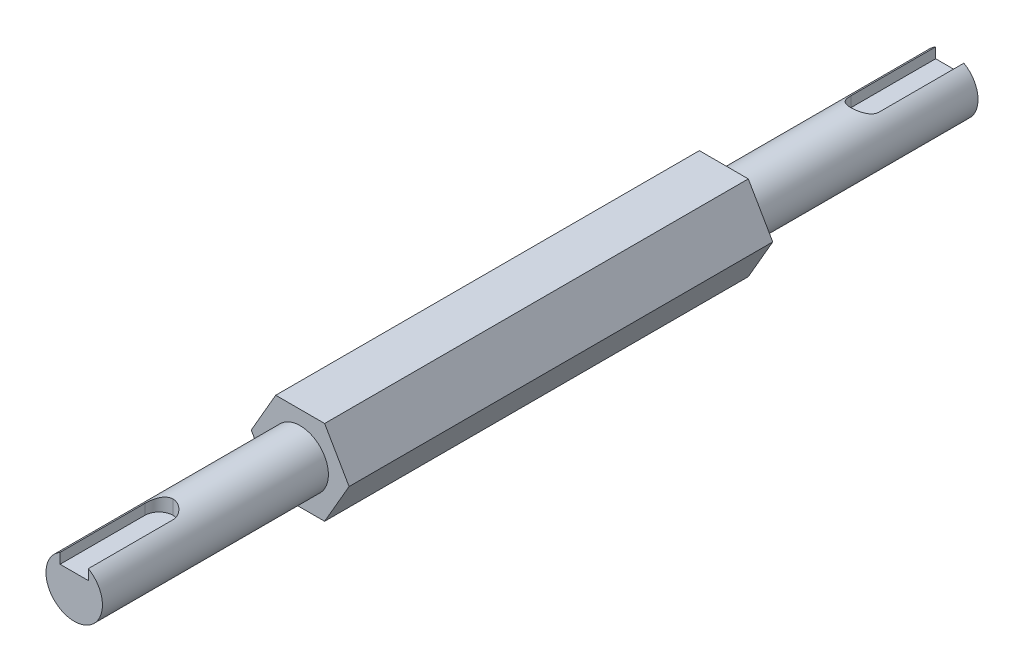
ISO-10303-21;
HEADER;
FILE_DESCRIPTION(('STEP AP214'),'2;1');
FILE_NAME('part.step','',(''),(''),'','','');
FILE_SCHEMA(('AUTOMOTIVE_DESIGN { 1 0 10303 214 1 1 1 1 }'));
ENDSEC;
DATA;
#1=APPLICATION_CONTEXT('core data for automotive mechanical design processes');
#2=APPLICATION_PROTOCOL_DEFINITION('international standard','automotive_design',2000,#1);
#3=PRODUCT_CONTEXT('',#1,'mechanical');
#4=PRODUCT('Part','Part','',(#3));
#5=PRODUCT_RELATED_PRODUCT_CATEGORY('part','',(#4));
#6=PRODUCT_DEFINITION_FORMATION('','',#4);
#7=PRODUCT_DEFINITION_CONTEXT('part definition',#1,'design');
#8=PRODUCT_DEFINITION('design','',#6,#7);
#9=PRODUCT_DEFINITION_SHAPE('','',#8);
#10=(LENGTH_UNIT() NAMED_UNIT(*) SI_UNIT(.MILLI.,.METRE.));
#11=(NAMED_UNIT(*) PLANE_ANGLE_UNIT() SI_UNIT($,.RADIAN.));
#12=(NAMED_UNIT(*) SI_UNIT($,.STERADIAN.) SOLID_ANGLE_UNIT());
#13=UNCERTAINTY_MEASURE_WITH_UNIT(LENGTH_MEASURE(1.E-05),#10,'distance_accuracy_value','');
#14=(GEOMETRIC_REPRESENTATION_CONTEXT(3) GLOBAL_UNCERTAINTY_ASSIGNED_CONTEXT((#13)) GLOBAL_UNIT_ASSIGNED_CONTEXT((#10,
#11,#12)) REPRESENTATION_CONTEXT('',''));
#15=CARTESIAN_POINT('',(0.,0.,0.));
#16=DIRECTION('',(0.,0.,1.));
#17=DIRECTION('',(1.,0.,0.));
#18=AXIS2_PLACEMENT_3D('',#15,#16,#17);
#19=CARTESIAN_POINT('',(0.,0.,-155.));
#20=DIRECTION('',(0.,0.,1.));
#21=DIRECTION('',(1.,0.,0.));
#22=AXIS2_PLACEMENT_3D('',#19,#20,#21);
#23=CYLINDRICAL_SURFACE('',#22,10.);
#24=CARTESIAN_POINT('',(0.,0.,-75.));
#25=DIRECTION('',(0.,0.,-1.));
#26=DIRECTION('',(-1.,0.,0.));
#27=AXIS2_PLACEMENT_3D('',#24,#25,#26);
#28=CIRCLE('',#27,10.);
#29=CARTESIAN_POINT('',(-10.,0.,-75.));
#30=VERTEX_POINT('',#29);
#31=EDGE_CURVE('E266',#30,#30,#28,.T.);
#32=ORIENTED_EDGE('',*,*,#31,.T.);
#33=EDGE_LOOP('',(#32));
#34=FACE_BOUND('',#33,.T.);
#35=CARTESIAN_POINT('',(5.,8.66025403784438,-125.));
#36=CARTESIAN_POINT('',(5.00002361888891,8.66021551330427,-124.869049639126));
#37=CARTESIAN_POINT('',(4.99485642352863,8.66322317171022,-124.738120661534));
#38=CARTESIAN_POINT('',(4.9743262011676,8.67504080296381,-124.477406344129));
#39=CARTESIAN_POINT('',(4.95896944028451,8.68384720982053,-124.347620351104));
#40=CARTESIAN_POINT('',(4.91836387161158,8.70690570763452,-124.090878105395));
#41=CARTESIAN_POINT('',(4.89317310468451,8.72112583452435,-123.96390978647));
#42=CARTESIAN_POINT('',(4.83323149405716,8.75448727669297,-123.712934259592));
#43=CARTESIAN_POINT('',(4.79847955294295,8.773629156865,-123.588927393325));
#44=CARTESIAN_POINT('',(4.68059587363615,8.83742329035318,-123.22307734072));
#45=CARTESIAN_POINT('',(4.58371167050504,8.88851945207841,-122.986633596926));
#46=CARTESIAN_POINT('',(4.35652740171114,9.00204021161088,-122.533173776049));
#47=CARTESIAN_POINT('',(4.22617416574287,9.0644827882417,-122.316189359844));
#48=CARTESIAN_POINT('',(3.92333046245637,9.19984701569684,-121.888468002505));
#49=CARTESIAN_POINT('',(3.74826652748174,9.27320802199905,-121.679691728181));
#50=CARTESIAN_POINT('',(3.3661902227377,9.41862187984104,-121.292897289751));
#51=CARTESIAN_POINT('',(3.15916803042063,9.49067432155078,-121.114888618014));
#52=CARTESIAN_POINT('',(2.82027569267716,9.59486177399818,-120.868732589407));
#53=CARTESIAN_POINT('',(2.69826543079268,9.6299691051782,-120.788009682604));
#54=CARTESIAN_POINT('',(2.44698124466883,9.69686293418397,-120.637234538355));
#55=CARTESIAN_POINT('',(2.31771046964858,9.72865085494352,-120.567177722721));
#56=CARTESIAN_POINT('',(2.05282662744898,9.78796784512354,-120.438468187722));
#57=CARTESIAN_POINT('',(1.91721936505834,9.81550071666006,-120.379805275111));
#58=CARTESIAN_POINT('',(1.64058795732737,9.86550553519196,-120.274500150322));
#59=CARTESIAN_POINT('',(1.49956734907817,9.88798072315259,-120.227850237429));
#60=CARTESIAN_POINT('',(1.24696348179509,9.92256495114501,-120.156652270877));
#61=CARTESIAN_POINT('',(1.13627328077336,9.93586871232813,-120.12948643006));
#62=CARTESIAN_POINT('',(0.912950872245471,9.95887130536837,-120.082731371089));
#63=CARTESIAN_POINT('',(0.800319100930296,9.96857093615972,-120.063140473744));
#64=CARTESIAN_POINT('',(0.573439771978736,9.98419294612303,-120.031669644401));
#65=CARTESIAN_POINT('',(0.459188926056762,9.99010599236984,-120.019808763575));
#66=CARTESIAN_POINT('',(0.229961151588944,9.99801728706722,-120.003965888074));
#67=CARTESIAN_POINT('',(0.114983943738853,10.0000139243983,-119.999987135915));
#68=CARTESIAN_POINT('',(0.,10.,-120.));
#69=B_SPLINE_CURVE_WITH_KNOTS('',3,(#35,#36,#37,#38,#39,#40,#41,#42,#43,#44,#45,#46,#47,#48,#49,
#50,#51,#52,#53,#54,#55,#56,#57,#58,#59,#60,#61,#62,#63,#64,#65,#66,#67,#68),.UNSPECIFIED.,.F.,
.F.,(4,2,2,2,2,2,2,2,2,2,2,2,2,2,2,2,4),(0.,0.392679602342989,0.785117948183225,
1.17527429103233,1.56547543400135,2.34355317866108,3.12287474188953,3.96590239319688,
4.80918967152436,5.26004529368137,5.7107068469499,6.16096335204243,6.6109305057813,
6.95487548064751,7.29874416704742,7.64345716907046,7.98831194828776),.UNSPECIFIED.);
#70=CARTESIAN_POINT('',(5.,8.66025403784438,-125.));
#71=VERTEX_POINT('',#70);
#72=CARTESIAN_POINT('',(0.,10.,-120.));
#73=VERTEX_POINT('',#72);
#74=EDGE_CURVE('E42',#71,#73,#69,.T.);
#75=ORIENTED_EDGE('',*,*,#74,.T.);
#76=CARTESIAN_POINT('',(0.,10.,-120.));
#77=CARTESIAN_POINT('',(-0.131991239469602,10.0000241782805,-119.999977601139));
#78=CARTESIAN_POINT('',(-0.263970628882904,9.99738765906262,-120.005225481239));
#79=CARTESIAN_POINT('',(-0.526850987566561,9.98697125681323,-120.026093501566));
#80=CARTESIAN_POINT('',(-0.657752368667024,9.97919343990117,-120.041709475205));
#81=CARTESIAN_POINT('',(-0.916935394044837,9.95871915073383,-120.08305084898));
#82=CARTESIAN_POINT('',(-1.0452262836237,9.94604534360643,-120.108729672694));
#83=CARTESIAN_POINT('',(-1.29890053779234,9.91610633855509,-120.169898539065));
#84=CARTESIAN_POINT('',(-1.42428372192544,9.8988408564894,-120.205389188901));
#85=CARTESIAN_POINT('',(-1.67114628273742,9.8601650174471,-120.285756351766));
#86=CARTESIAN_POINT('',(-1.79263094486756,9.83876057493977,-120.33061947903));
#87=CARTESIAN_POINT('',(-2.03118581554616,9.79229709918266,-120.429335856685));
#88=CARTESIAN_POINT('',(-2.14825433648659,9.76723668627511,-120.483192502085));
#89=CARTESIAN_POINT('',(-2.4919857638862,9.68737364782394,-120.6576535993));
#90=CARTESIAN_POINT('',(-2.71117534822375,9.62788908947369,-120.791149479643));
#91=CARTESIAN_POINT('',(-3.13757538731889,9.49780820199455,-121.097601637018));
#92=CARTESIAN_POINT('',(-3.34328207637021,9.42675973385601,-121.272442460829));
#93=CARTESIAN_POINT('',(-3.72387270816202,9.28300571887814,-121.652578854062));
#94=CARTESIAN_POINT('',(-3.89873165397419,9.21029888159085,-121.857898875953));
#95=CARTESIAN_POINT('',(-4.22640678760479,9.06488412578834,-122.312646249707));
#96=CARTESIAN_POINT('',(-4.37642491072512,8.99262189769115,-122.564268429368));
#97=CARTESIAN_POINT('',(-4.56745034472612,8.89626237102638,-122.96040971096));
#98=CARTESIAN_POINT('',(-4.62544363667002,8.8661569150135,-123.095522352474));
#99=CARTESIAN_POINT('',(-4.72955995362192,8.81105745348692,-123.371220243102));
#100=CARTESIAN_POINT('',(-4.7756910296989,8.786059983483,-123.511801705439));
#101=CARTESIAN_POINT('',(-4.84586480669606,8.74750169059237,-123.762958804369));
#102=CARTESIAN_POINT('',(-4.87255148593207,8.73263643182637,-123.872605814687));
#103=CARTESIAN_POINT('',(-4.9185074627793,8.70683502441639,-124.093883756156));
#104=CARTESIAN_POINT('',(-4.93777858999978,8.69589790664246,-124.205514190825));
#105=CARTESIAN_POINT('',(-4.96877057631204,8.67822894216377,-124.430563629019));
#106=CARTESIAN_POINT('',(-4.98046391773374,8.67151242462562,-124.543987635783));
#107=CARTESIAN_POINT('',(-4.99608785784789,8.66251234350782,-124.771604069188));
#108=CARTESIAN_POINT('',(-5.0000142599403,8.66023117642948,-124.885796877808));
#109=CARTESIAN_POINT('',(-5.,8.66025403784439,-125.));
#110=B_SPLINE_CURVE_WITH_KNOTS('',3,(#76,#77,#78,#79,#80,#81,#82,#83,#84,#85,#86,#87,#88,#89,
#90,#91,#92,#93,#94,#95,#96,#97,#98,#99,#100,#101,#102,#103,#104,#105,#106,#107,#108,#109),
.UNSPECIFIED.,.F.,.F.,(4,2,2,2,2,2,2,2,2,2,2,2,2,2,2,2,4),(0.,0.395824516939796,
0.791490061573844,1.1853454771675,1.57922527097024,1.97254632528296,2.36601619341385,
3.15295336018615,3.98702315318757,4.82176574617551,5.72186996410697,6.17159557922642,
6.62101514813637,6.96218512181261,7.30327086594243,7.64558837579788,7.98809079474593),.UNSPECIFIED.);
#111=CARTESIAN_POINT('',(-5.,8.66025403784439,-125.));
#112=VERTEX_POINT('',#111);
#113=EDGE_CURVE('E11',#73,#112,#110,.T.);
#114=ORIENTED_EDGE('',*,*,#113,.T.);
#115=DIRECTION('',(0.,0.,1.));
#116=VECTOR('',#115,1.);
#117=CARTESIAN_POINT('',(-5.,8.66025403784439,-155.));
#118=LINE('',#117,#116);
#119=CARTESIAN_POINT('',(-5.,8.66025403784439,-155.));
#120=VERTEX_POINT('',#119);
#121=EDGE_CURVE('E151',#120,#112,#118,.T.);
#122=ORIENTED_EDGE('',*,*,#121,.F.);
#123=CARTESIAN_POINT('',(0.,0.,-155.));
#124=DIRECTION('',(0.,0.,-1.));
#125=DIRECTION('',(-1.,0.,0.));
#126=AXIS2_PLACEMENT_3D('',#123,#124,#125);
#127=CIRCLE('',#126,10.);
#128=CARTESIAN_POINT('',(5.,8.66025403784438,-155.));
#129=VERTEX_POINT('',#128);
#130=EDGE_CURVE('E166',#129,#120,#127,.T.);
#131=ORIENTED_EDGE('',*,*,#130,.F.);
#132=DIRECTION('',(0.,0.,1.));
#133=VECTOR('',#132,1.);
#134=CARTESIAN_POINT('',(5.,8.66025403784438,-155.));
#135=LINE('',#134,#133);
#136=EDGE_CURVE('E355',#71,#129,#135,.F.);
#137=ORIENTED_EDGE('',*,*,#136,.F.);
#138=EDGE_LOOP('',(#75,#114,#122,#131,#137));
#139=FACE_BOUND('',#138,.T.);
#140=ADVANCED_FACE('F32',(#34,#139),#23,.T.);
#141=CARTESIAN_POINT('',(0.,0.,-155.));
#142=DIRECTION('',(0.,0.,-1.));
#143=DIRECTION('',(-1.,0.,0.));
#144=AXIS2_PLACEMENT_3D('',#141,#142,#143);
#145=PLANE('',#144);
#146=DIRECTION('',(1.,0.,0.));
#147=VECTOR('',#146,1.);
#148=CARTESIAN_POINT('',(-5.,5.,-155.));
#149=LINE('',#148,#147);
#150=CARTESIAN_POINT('',(-5.,5.,-155.));
#151=VERTEX_POINT('',#150);
#152=CARTESIAN_POINT('',(5.,5.,-155.));
#153=VERTEX_POINT('',#152);
#154=EDGE_CURVE('E155',#151,#153,#149,.T.);
#155=ORIENTED_EDGE('',*,*,#154,.T.);
#156=DIRECTION('',(0.,1.,0.));
#157=VECTOR('',#156,1.);
#158=CARTESIAN_POINT('',(5.,23.6468090190601,-155.));
#159=LINE('',#158,#157);
#160=EDGE_CURVE('E161',#153,#129,#159,.T.);
#161=ORIENTED_EDGE('',*,*,#160,.T.);
#162=ORIENTED_EDGE('',*,*,#130,.T.);
#163=DIRECTION('',(0.,-1.,0.));
#164=VECTOR('',#163,1.);
#165=CARTESIAN_POINT('',(-5.,0.,-155.));
#166=LINE('',#165,#164);
#167=EDGE_CURVE('E146',#120,#151,#166,.T.);
#168=ORIENTED_EDGE('',*,*,#167,.T.);
#169=EDGE_LOOP('',(#155,#161,#162,#168));
#170=FACE_BOUND('',#169,.T.);
#171=ADVANCED_FACE('F164',(#170),#145,.T.);
#172=CARTESIAN_POINT('',(17.3205080756888,0.,75.));
#173=DIRECTION('',(-0.866025403784438,-0.5,0.));
#174=DIRECTION('',(0.5,-0.866025403784439,0.));
#175=AXIS2_PLACEMENT_3D('',#172,#173,#174);
#176=PLANE('',#175);
#177=DIRECTION('',(-0.5,0.866025403784438,0.));
#178=VECTOR('',#177,1.);
#179=CARTESIAN_POINT('',(17.3205080756888,0.,-75.));
#180=LINE('',#179,#178);
#181=CARTESIAN_POINT('',(17.3205080756888,0.,-75.));
#182=VERTEX_POINT('',#181);
#183=CARTESIAN_POINT('',(8.66025403784438,15.,-75.));
#184=VERTEX_POINT('',#183);
#185=EDGE_CURVE('E281',#182,#184,#180,.T.);
#186=ORIENTED_EDGE('',*,*,#185,.T.);
#187=DIRECTION('',(0.,0.,-1.));
#188=VECTOR('',#187,1.);
#189=CARTESIAN_POINT('',(8.66025403784438,15.,75.));
#190=LINE('',#189,#188);
#191=CARTESIAN_POINT('',(8.66025403784438,15.,75.));
#192=VERTEX_POINT('',#191);
#193=EDGE_CURVE('E274',#192,#184,#190,.T.);
#194=ORIENTED_EDGE('',*,*,#193,.F.);
#195=DIRECTION('',(-0.5,0.866025403784438,0.));
#196=VECTOR('',#195,1.);
#197=CARTESIAN_POINT('',(17.3205080756888,0.,75.));
#198=LINE('',#197,#196);
#199=CARTESIAN_POINT('',(17.3205080756888,0.,75.));
#200=VERTEX_POINT('',#199);
#201=EDGE_CURVE('E283',#200,#192,#198,.T.);
#202=ORIENTED_EDGE('',*,*,#201,.F.);
#203=DIRECTION('',(0.,0.,-1.));
#204=VECTOR('',#203,1.);
#205=CARTESIAN_POINT('',(17.3205080756888,0.,75.));
#206=LINE('',#205,#204);
#207=EDGE_CURVE('E297',#200,#182,#206,.T.);
#208=ORIENTED_EDGE('',*,*,#207,.T.);
#209=EDGE_LOOP('',(#186,#194,#202,#208));
#210=FACE_BOUND('',#209,.T.);
#211=ADVANCED_FACE('F252',(#210),#176,.F.);
#212=CARTESIAN_POINT('',(8.66025403784438,15.,75.));
#213=DIRECTION('',(0.,-1.,0.));
#214=DIRECTION('',(1.,0.,0.));
#215=AXIS2_PLACEMENT_3D('',#212,#213,#214);
#216=PLANE('',#215);
#217=DIRECTION('',(-1.,0.,0.));
#218=VECTOR('',#217,1.);
#219=CARTESIAN_POINT('',(8.66025403784438,15.,-75.));
#220=LINE('',#219,#218);
#221=CARTESIAN_POINT('',(-8.66025403784438,15.,-75.));
#222=VERTEX_POINT('',#221);
#223=EDGE_CURVE('E299',#184,#222,#220,.T.);
#224=ORIENTED_EDGE('',*,*,#223,.T.);
#225=DIRECTION('',(0.,0.,-1.));
#226=VECTOR('',#225,1.);
#227=CARTESIAN_POINT('',(-8.66025403784438,15.,75.));
#228=LINE('',#227,#226);
#229=CARTESIAN_POINT('',(-8.66025403784438,15.,75.));
#230=VERTEX_POINT('',#229);
#231=EDGE_CURVE('E319',#230,#222,#228,.T.);
#232=ORIENTED_EDGE('',*,*,#231,.F.);
#233=DIRECTION('',(-1.,0.,0.));
#234=VECTOR('',#233,1.);
#235=CARTESIAN_POINT('',(8.66025403784438,15.,75.));
#236=LINE('',#235,#234);
#237=EDGE_CURVE('E286',#192,#230,#236,.T.);
#238=ORIENTED_EDGE('',*,*,#237,.F.);
#239=ORIENTED_EDGE('',*,*,#193,.T.);
#240=EDGE_LOOP('',(#224,#232,#238,#239));
#241=FACE_BOUND('',#240,.T.);
#242=ADVANCED_FACE('F249',(#241),#216,.F.);
#243=CARTESIAN_POINT('',(-8.66025403784438,15.,75.));
#244=DIRECTION('',(0.866025403784438,-0.5,0.));
#245=DIRECTION('',(0.5,0.866025403784439,0.));
#246=AXIS2_PLACEMENT_3D('',#243,#244,#245);
#247=PLANE('',#246);
#248=DIRECTION('',(-0.5,-0.866025403784438,0.));
#249=VECTOR('',#248,1.);
#250=CARTESIAN_POINT('',(-8.66025403784438,15.,-75.));
#251=LINE('',#250,#249);
#252=CARTESIAN_POINT('',(-17.3205080756888,0.,-75.));
#253=VERTEX_POINT('',#252);
#254=EDGE_CURVE('E301',#222,#253,#251,.T.);
#255=ORIENTED_EDGE('',*,*,#254,.T.);
#256=DIRECTION('',(0.,0.,-1.));
#257=VECTOR('',#256,1.);
#258=CARTESIAN_POINT('',(-17.3205080756888,0.,75.));
#259=LINE('',#258,#257);
#260=CARTESIAN_POINT('',(-17.3205080756888,0.,75.));
#261=VERTEX_POINT('',#260);
#262=EDGE_CURVE('E316',#261,#253,#259,.T.);
#263=ORIENTED_EDGE('',*,*,#262,.F.);
#264=DIRECTION('',(-0.5,-0.866025403784438,0.));
#265=VECTOR('',#264,1.);
#266=CARTESIAN_POINT('',(-8.66025403784438,15.,75.));
#267=LINE('',#266,#265);
#268=EDGE_CURVE('E289',#230,#261,#267,.T.);
#269=ORIENTED_EDGE('',*,*,#268,.F.);
#270=ORIENTED_EDGE('',*,*,#231,.T.);
#271=EDGE_LOOP('',(#255,#263,#269,#270));
#272=FACE_BOUND('',#271,.T.);
#273=ADVANCED_FACE('F245',(#272),#247,.F.);
#274=CARTESIAN_POINT('',(-17.3205080756888,0.,75.));
#275=DIRECTION('',(0.866025403784438,0.5,0.));
#276=DIRECTION('',(-0.5,0.866025403784439,0.));
#277=AXIS2_PLACEMENT_3D('',#274,#275,#276);
#278=PLANE('',#277);
#279=DIRECTION('',(0.5,-0.866025403784438,0.));
#280=VECTOR('',#279,1.);
#281=CARTESIAN_POINT('',(-17.3205080756888,0.,-75.));
#282=LINE('',#281,#280);
#283=CARTESIAN_POINT('',(-8.66025403784438,-15.,-75.));
#284=VERTEX_POINT('',#283);
#285=EDGE_CURVE('E303',#253,#284,#282,.T.);
#286=ORIENTED_EDGE('',*,*,#285,.T.);
#287=DIRECTION('',(0.,0.,-1.));
#288=VECTOR('',#287,1.);
#289=CARTESIAN_POINT('',(-8.66025403784438,-15.,75.));
#290=LINE('',#289,#288);
#291=CARTESIAN_POINT('',(-8.66025403784438,-15.,75.));
#292=VERTEX_POINT('',#291);
#293=EDGE_CURVE('E313',#292,#284,#290,.T.);
#294=ORIENTED_EDGE('',*,*,#293,.F.);
#295=DIRECTION('',(0.5,-0.866025403784438,0.));
#296=VECTOR('',#295,1.);
#297=CARTESIAN_POINT('',(-17.3205080756888,0.,75.));
#298=LINE('',#297,#296);
#299=EDGE_CURVE('E291',#261,#292,#298,.T.);
#300=ORIENTED_EDGE('',*,*,#299,.F.);
#301=ORIENTED_EDGE('',*,*,#262,.T.);
#302=EDGE_LOOP('',(#286,#294,#300,#301));
#303=FACE_BOUND('',#302,.T.);
#304=ADVANCED_FACE('F241',(#303),#278,.F.);
#305=CARTESIAN_POINT('',(-8.66025403784438,-15.,75.));
#306=DIRECTION('',(0.,1.,0.));
#307=DIRECTION('',(-1.,0.,0.));
#308=AXIS2_PLACEMENT_3D('',#305,#306,#307);
#309=PLANE('',#308);
#310=DIRECTION('',(1.,0.,0.));
#311=VECTOR('',#310,1.);
#312=CARTESIAN_POINT('',(-8.66025403784438,-15.,-75.));
#313=LINE('',#312,#311);
#314=CARTESIAN_POINT('',(8.66025403784439,-15.,-75.));
#315=VERTEX_POINT('',#314);
#316=EDGE_CURVE('E305',#284,#315,#313,.T.);
#317=ORIENTED_EDGE('',*,*,#316,.T.);
#318=DIRECTION('',(0.,0.,-1.));
#319=VECTOR('',#318,1.);
#320=CARTESIAN_POINT('',(8.66025403784439,-15.,75.));
#321=LINE('',#320,#319);
#322=CARTESIAN_POINT('',(8.66025403784439,-15.,75.));
#323=VERTEX_POINT('',#322);
#324=EDGE_CURVE('E310',#323,#315,#321,.T.);
#325=ORIENTED_EDGE('',*,*,#324,.F.);
#326=DIRECTION('',(1.,0.,0.));
#327=VECTOR('',#326,1.);
#328=CARTESIAN_POINT('',(-8.66025403784438,-15.,75.));
#329=LINE('',#328,#327);
#330=EDGE_CURVE('E293',#292,#323,#329,.T.);
#331=ORIENTED_EDGE('',*,*,#330,.F.);
#332=ORIENTED_EDGE('',*,*,#293,.T.);
#333=EDGE_LOOP('',(#317,#325,#331,#332));
#334=FACE_BOUND('',#333,.T.);
#335=ADVANCED_FACE('F237',(#334),#309,.F.);
#336=CARTESIAN_POINT('',(8.66025403784439,-15.,75.));
#337=DIRECTION('',(-0.866025403784438,0.5,0.));
#338=DIRECTION('',(-0.5,-0.866025403784439,0.));
#339=AXIS2_PLACEMENT_3D('',#336,#337,#338);
#340=PLANE('',#339);
#341=DIRECTION('',(0.5,0.866025403784438,0.));
#342=VECTOR('',#341,1.);
#343=CARTESIAN_POINT('',(8.66025403784439,-15.,-75.));
#344=LINE('',#343,#342);
#345=EDGE_CURVE('E287',#315,#182,#344,.T.);
#346=ORIENTED_EDGE('',*,*,#345,.T.);
#347=ORIENTED_EDGE('',*,*,#207,.F.);
#348=DIRECTION('',(0.5,0.866025403784438,0.));
#349=VECTOR('',#348,1.);
#350=CARTESIAN_POINT('',(8.66025403784439,-15.,75.));
#351=LINE('',#350,#349);
#352=EDGE_CURVE('E295',#323,#200,#351,.T.);
#353=ORIENTED_EDGE('',*,*,#352,.F.);
#354=ORIENTED_EDGE('',*,*,#324,.T.);
#355=EDGE_LOOP('',(#346,#347,#353,#354));
#356=FACE_BOUND('',#355,.T.);
#357=ADVANCED_FACE('F230',(#356),#340,.F.);
#358=CARTESIAN_POINT('',(0.,0.,75.));
#359=DIRECTION('',(0.,0.,1.));
#360=DIRECTION('',(1.,0.,0.));
#361=AXIS2_PLACEMENT_3D('',#358,#359,#360);
#362=PLANE('',#361);
#363=CARTESIAN_POINT('',(0.,0.,75.));
#364=DIRECTION('',(0.,0.,1.));
#365=DIRECTION('',(1.,0.,0.));
#366=AXIS2_PLACEMENT_3D('',#363,#364,#365);
#367=CIRCLE('',#366,10.);
#368=CARTESIAN_POINT('',(10.,0.,75.));
#369=VERTEX_POINT('',#368);
#370=EDGE_CURVE('E268',#369,#369,#367,.T.);
#371=ORIENTED_EDGE('',*,*,#370,.F.);
#372=EDGE_LOOP('',(#371));
#373=FACE_BOUND('',#372,.T.);
#374=ORIENTED_EDGE('',*,*,#201,.T.);
#375=ORIENTED_EDGE('',*,*,#237,.T.);
#376=ORIENTED_EDGE('',*,*,#268,.T.);
#377=ORIENTED_EDGE('',*,*,#299,.T.);
#378=ORIENTED_EDGE('',*,*,#330,.T.);
#379=ORIENTED_EDGE('',*,*,#352,.T.);
#380=EDGE_LOOP('',(#374,#375,#376,#377,#378,#379));
#381=FACE_BOUND('',#380,.T.);
#382=ADVANCED_FACE('F226',(#373,#381),#362,.T.);
#383=CARTESIAN_POINT('',(0.,0.,-75.));
#384=DIRECTION('',(0.,0.,1.));
#385=DIRECTION('',(1.,0.,0.));
#386=AXIS2_PLACEMENT_3D('',#383,#384,#385);
#387=PLANE('',#386);
#388=ORIENTED_EDGE('',*,*,#31,.F.);
#389=EDGE_LOOP('',(#388));
#390=FACE_BOUND('',#389,.T.);
#391=ORIENTED_EDGE('',*,*,#185,.F.);
#392=ORIENTED_EDGE('',*,*,#345,.F.);
#393=ORIENTED_EDGE('',*,*,#316,.F.);
#394=ORIENTED_EDGE('',*,*,#285,.F.);
#395=ORIENTED_EDGE('',*,*,#254,.F.);
#396=ORIENTED_EDGE('',*,*,#223,.F.);
#397=EDGE_LOOP('',(#391,#392,#393,#394,#395,#396));
#398=FACE_BOUND('',#397,.T.);
#399=ADVANCED_FACE('F224',(#390,#398),#387,.F.);
#400=CARTESIAN_POINT('',(0.,0.,155.));
#401=DIRECTION('',(0.,0.,-1.));
#402=DIRECTION('',(-1.,0.,0.));
#403=AXIS2_PLACEMENT_3D('',#400,#401,#402);
#404=CYLINDRICAL_SURFACE('',#403,10.);
#405=DIRECTION('',(0.,0.,-1.));
#406=VECTOR('',#405,1.);
#407=CARTESIAN_POINT('',(-5.,8.66025403784439,155.));
#408=LINE('',#407,#406);
#409=CARTESIAN_POINT('',(-5.,8.66025403784439,155.));
#410=VERTEX_POINT('',#409);
#411=CARTESIAN_POINT('',(-5.,8.66025403784439,125.));
#412=VERTEX_POINT('',#411);
#413=EDGE_CURVE('E350',#410,#412,#408,.T.);
#414=ORIENTED_EDGE('',*,*,#413,.T.);
#415=CARTESIAN_POINT('',(-5.,8.66025403784439,125.));
#416=CARTESIAN_POINT('',(-5.0000236188889,8.66021551330428,124.869049639126));
#417=CARTESIAN_POINT('',(-4.99485642352862,8.66322317171022,124.738120661534));
#418=CARTESIAN_POINT('',(-4.9743262011676,8.67504080296381,124.477406344129));
#419=CARTESIAN_POINT('',(-4.95896944028451,8.68384720982053,124.347620351104));
#420=CARTESIAN_POINT('',(-4.91836387161157,8.70690570763452,124.090878105395));
#421=CARTESIAN_POINT('',(-4.89317310468451,8.72112583452435,123.96390978647));
#422=CARTESIAN_POINT('',(-4.83323149405715,8.75448727669297,123.712934259592));
#423=CARTESIAN_POINT('',(-4.79847955294295,8.773629156865,123.588927393325));
#424=CARTESIAN_POINT('',(-4.68059587363615,8.83742329035318,123.22307734072));
#425=CARTESIAN_POINT('',(-4.58371167050503,8.88851945207841,122.986633596926));
#426=CARTESIAN_POINT('',(-4.35652740171114,9.00204021161088,122.533173776049));
#427=CARTESIAN_POINT('',(-4.22617416574286,9.06448278824171,122.316189359844));
#428=CARTESIAN_POINT('',(-3.92333046245637,9.19984701569684,121.888468002505));
#429=CARTESIAN_POINT('',(-3.74826652748173,9.27320802199905,121.679691728181));
#430=CARTESIAN_POINT('',(-3.3661902227377,9.41862187984105,121.292897289751));
#431=CARTESIAN_POINT('',(-3.15916803042063,9.49067432155078,121.114888618014));
#432=CARTESIAN_POINT('',(-2.82027569267716,9.59486177399818,120.868732589407));
#433=CARTESIAN_POINT('',(-2.69826543079268,9.6299691051782,120.788009682604));
#434=CARTESIAN_POINT('',(-2.44698124466883,9.69686293418397,120.637234538355));
#435=CARTESIAN_POINT('',(-2.31771046964858,9.72865085494352,120.567177722721));
#436=CARTESIAN_POINT('',(-2.05282662744898,9.78796784512354,120.438468187722));
#437=CARTESIAN_POINT('',(-1.91721936505834,9.81550071666006,120.379805275111));
#438=CARTESIAN_POINT('',(-1.64058795732737,9.86550553519196,120.274500150322));
#439=CARTESIAN_POINT('',(-1.49956734907817,9.88798072315259,120.227850237429));
#440=CARTESIAN_POINT('',(-1.24696348179509,9.92256495114501,120.156652270877));
#441=CARTESIAN_POINT('',(-1.13627328077336,9.93586871232813,120.12948643006));
#442=CARTESIAN_POINT('',(-0.912950872245469,9.95887130536837,120.082731371089));
#443=CARTESIAN_POINT('',(-0.800319100930295,9.96857093615972,120.063140473744));
#444=CARTESIAN_POINT('',(-0.573439771978735,9.98419294612303,120.031669644401));
#445=CARTESIAN_POINT('',(-0.45918892605676,9.99010599236984,120.019808763575));
#446=CARTESIAN_POINT('',(-0.229961151588942,9.99801728706722,120.003965888074));
#447=CARTESIAN_POINT('',(-0.114983943738852,10.0000139243983,119.999987135915));
#448=CARTESIAN_POINT('',(0.,10.,120.));
#449=B_SPLINE_CURVE_WITH_KNOTS('',3,(#415,#416,#417,#418,#419,#420,#421,#422,#423,#424,#425,
#426,#427,#428,#429,#430,#431,#432,#433,#434,#435,#436,#437,#438,#439,#440,#441,#442,#443,#444,
#445,#446,#447,#448),.UNSPECIFIED.,.F.,.F.,(4,2,2,2,2,2,2,2,2,2,2,2,2,2,2,2,4),(0.,
0.392679602342989,0.785117948183225,1.17527429103233,1.56547543400135,2.3435531786611,
3.12287474188953,3.96590239319688,4.80918967152436,5.26004529368137,5.7107068469499,
6.16096335204242,6.6109305057813,6.95487548064751,7.29874416704742,7.64345716907046,
7.98831194828776),.UNSPECIFIED.);
#450=CARTESIAN_POINT('',(0.,10.,120.));
#451=VERTEX_POINT('',#450);
#452=EDGE_CURVE('E168',#412,#451,#449,.T.);
#453=ORIENTED_EDGE('',*,*,#452,.T.);
#454=CARTESIAN_POINT('',(0.,10.,120.));
#455=CARTESIAN_POINT('',(0.131991239469603,10.0000241782805,119.999977601139));
#456=CARTESIAN_POINT('',(0.263970628882905,9.99738765906262,120.005225481239));
#457=CARTESIAN_POINT('',(0.526850987566562,9.98697125681323,120.026093501566));
#458=CARTESIAN_POINT('',(0.657752368667025,9.97919343990117,120.041709475205));
#459=CARTESIAN_POINT('',(0.916935394044838,9.95871915073382,120.08305084898));
#460=CARTESIAN_POINT('',(1.04522628362371,9.94604534360643,120.108729672694));
#461=CARTESIAN_POINT('',(1.29890053779234,9.91610633855509,120.169898539065));
#462=CARTESIAN_POINT('',(1.42428372192544,9.8988408564894,120.205389188901));
#463=CARTESIAN_POINT('',(1.67114628273742,9.8601650174471,120.285756351766));
#464=CARTESIAN_POINT('',(1.79263094486756,9.83876057493976,120.33061947903));
#465=CARTESIAN_POINT('',(2.03118581554616,9.79229709918265,120.429335856685));
#466=CARTESIAN_POINT('',(2.14825433648659,9.76723668627511,120.483192502085));
#467=CARTESIAN_POINT('',(2.4919857638862,9.68737364782394,120.6576535993));
#468=CARTESIAN_POINT('',(2.71117534822376,9.62788908947369,120.791149479643));
#469=CARTESIAN_POINT('',(3.13757538731889,9.49780820199455,121.097601637018));
#470=CARTESIAN_POINT('',(3.34328207637021,9.42675973385601,121.272442460829));
#471=CARTESIAN_POINT('',(3.72387270816202,9.28300571887814,121.652578854062));
#472=CARTESIAN_POINT('',(3.89873165397419,9.21029888159085,121.857898875953));
#473=CARTESIAN_POINT('',(4.22640678760479,9.06488412578834,122.312646249707));
#474=CARTESIAN_POINT('',(4.37642491072513,8.99262189769115,122.564268429368));
#475=CARTESIAN_POINT('',(4.56745034472612,8.89626237102638,122.96040971096));
#476=CARTESIAN_POINT('',(4.62544363667002,8.86615691501351,123.095522352474));
#477=CARTESIAN_POINT('',(4.72955995362192,8.81105745348692,123.371220243102));
#478=CARTESIAN_POINT('',(4.7756910296989,8.78605998348299,123.511801705439));
#479=CARTESIAN_POINT('',(4.84586480669607,8.74750169059237,123.762958804369));
#480=CARTESIAN_POINT('',(4.87255148593207,8.73263643182637,123.872605814687));
#481=CARTESIAN_POINT('',(4.9185074627793,8.70683502441639,124.093883756156));
#482=CARTESIAN_POINT('',(4.93777858999978,8.69589790664246,124.205514190825));
#483=CARTESIAN_POINT('',(4.96877057631205,8.67822894216378,124.430563629019));
#484=CARTESIAN_POINT('',(4.98046391773375,8.67151242462562,124.543987635783));
#485=CARTESIAN_POINT('',(4.99608785784789,8.66251234350782,124.771604069188));
#486=CARTESIAN_POINT('',(5.00001425994031,8.66023117642947,124.885796877808));
#487=CARTESIAN_POINT('',(5.,8.66025403784439,125.));
#488=B_SPLINE_CURVE_WITH_KNOTS('',3,(#454,#455,#456,#457,#458,#459,#460,#461,#462,#463,#464,
#465,#466,#467,#468,#469,#470,#471,#472,#473,#474,#475,#476,#477,#478,#479,#480,#481,#482,#483,
#484,#485,#486,#487),.UNSPECIFIED.,.F.,.F.,(4,2,2,2,2,2,2,2,2,2,2,2,2,2,2,2,4),(0.,
0.395824516939795,0.791490061573842,1.1853454771675,1.57922527097024,1.97254632528296,
2.36601619341385,3.15295336018615,3.98702315318759,4.82176574617551,5.72186996410697,
6.17159557922642,6.62101514813637,6.96218512181264,7.30327086594243,7.64558837579788,
7.98809079474593),.UNSPECIFIED.);
#489=CARTESIAN_POINT('',(5.,8.66025403784438,125.));
#490=VERTEX_POINT('',#489);
#491=EDGE_CURVE('E173',#451,#490,#488,.T.);
#492=ORIENTED_EDGE('',*,*,#491,.T.);
#493=DIRECTION('',(0.,0.,-1.));
#494=VECTOR('',#493,1.);
#495=CARTESIAN_POINT('',(5.,8.66025403784438,155.));
#496=LINE('',#495,#494);
#497=CARTESIAN_POINT('',(5.,8.66025403784438,155.));
#498=VERTEX_POINT('',#497);
#499=EDGE_CURVE('E338',#490,#498,#496,.F.);
#500=ORIENTED_EDGE('',*,*,#499,.T.);
#501=CARTESIAN_POINT('',(0.,0.,155.));
#502=DIRECTION('',(0.,0.,1.));
#503=DIRECTION('',(1.,0.,0.));
#504=AXIS2_PLACEMENT_3D('',#501,#502,#503);
#505=CIRCLE('',#504,10.);
#506=EDGE_CURVE('E279',#410,#498,#505,.T.);
#507=ORIENTED_EDGE('',*,*,#506,.F.);
#508=EDGE_LOOP('',(#414,#453,#492,#500,#507));
#509=FACE_BOUND('',#508,.T.);
#510=ORIENTED_EDGE('',*,*,#370,.T.);
#511=EDGE_LOOP('',(#510));
#512=FACE_BOUND('',#511,.T.);
#513=ADVANCED_FACE('F219',(#509,#512),#404,.T.);
#514=CARTESIAN_POINT('',(0.,0.,155.));
#515=DIRECTION('',(0.,0.,1.));
#516=DIRECTION('',(1.,0.,0.));
#517=AXIS2_PLACEMENT_3D('',#514,#515,#516);
#518=PLANE('',#517);
#519=DIRECTION('',(0.,1.,0.));
#520=VECTOR('',#519,1.);
#521=CARTESIAN_POINT('',(5.,23.6468090190601,155.));
#522=LINE('',#521,#520);
#523=CARTESIAN_POINT('',(5.,5.,155.));
#524=VERTEX_POINT('',#523);
#525=EDGE_CURVE('E349',#524,#498,#522,.T.);
#526=ORIENTED_EDGE('',*,*,#525,.F.);
#527=DIRECTION('',(1.,0.,0.));
#528=VECTOR('',#527,1.);
#529=CARTESIAN_POINT('',(-5.,5.,155.));
#530=LINE('',#529,#528);
#531=CARTESIAN_POINT('',(-5.,5.,155.));
#532=VERTEX_POINT('',#531);
#533=EDGE_CURVE('E356',#532,#524,#530,.T.);
#534=ORIENTED_EDGE('',*,*,#533,.F.);
#535=DIRECTION('',(0.,-1.,0.));
#536=VECTOR('',#535,1.);
#537=CARTESIAN_POINT('',(-5.,0.,155.));
#538=LINE('',#537,#536);
#539=EDGE_CURVE('E267',#410,#532,#538,.T.);
#540=ORIENTED_EDGE('',*,*,#539,.F.);
#541=ORIENTED_EDGE('',*,*,#506,.T.);
#542=EDGE_LOOP('',(#526,#534,#540,#541));
#543=FACE_BOUND('',#542,.T.);
#544=ADVANCED_FACE('F223',(#543),#518,.T.);
#545=CARTESIAN_POINT('',(5.,23.6468090190601,120.));
#546=DIRECTION('',(1.,0.,0.));
#547=DIRECTION('',(0.,1.,0.));
#548=AXIS2_PLACEMENT_3D('',#545,#546,#547);
#549=PLANE('',#548);
#550=ORIENTED_EDGE('',*,*,#499,.F.);
#551=DIRECTION('',(0.,1.,0.));
#552=VECTOR('',#551,1.);
#553=CARTESIAN_POINT('',(5.,23.6468090190601,125.));
#554=LINE('',#553,#552);
#555=CARTESIAN_POINT('',(5.,5.,125.));
#556=VERTEX_POINT('',#555);
#557=EDGE_CURVE('E271',#490,#556,#554,.F.);
#558=ORIENTED_EDGE('',*,*,#557,.T.);
#559=DIRECTION('',(0.,0.,1.));
#560=VECTOR('',#559,1.);
#561=CARTESIAN_POINT('',(5.,5.,120.));
#562=LINE('',#561,#560);
#563=EDGE_CURVE('E354',#556,#524,#562,.T.);
#564=ORIENTED_EDGE('',*,*,#563,.T.);
#565=ORIENTED_EDGE('',*,*,#525,.T.);
#566=EDGE_LOOP('',(#550,#558,#564,#565));
#567=FACE_BOUND('',#566,.T.);
#568=ADVANCED_FACE('F346',(#567),#549,.F.);
#569=CARTESIAN_POINT('',(-5.,23.6468090190601,120.));
#570=DIRECTION('',(-1.,0.,0.));
#571=DIRECTION('',(0.,-1.,0.));
#572=AXIS2_PLACEMENT_3D('',#569,#570,#571);
#573=PLANE('',#572);
#574=DIRECTION('',(0.,0.,1.));
#575=VECTOR('',#574,1.);
#576=CARTESIAN_POINT('',(-5.,5.,120.));
#577=LINE('',#576,#575);
#578=CARTESIAN_POINT('',(-5.,5.,125.));
#579=VERTEX_POINT('',#578);
#580=EDGE_CURVE('E364',#579,#532,#577,.T.);
#581=ORIENTED_EDGE('',*,*,#580,.F.);
#582=DIRECTION('',(0.,-1.,0.));
#583=VECTOR('',#582,1.);
#584=CARTESIAN_POINT('',(-5.,23.6468090190601,125.));
#585=LINE('',#584,#583);
#586=EDGE_CURVE('E329',#579,#412,#585,.F.);
#587=ORIENTED_EDGE('',*,*,#586,.T.);
#588=ORIENTED_EDGE('',*,*,#413,.F.);
#589=ORIENTED_EDGE('',*,*,#539,.T.);
#590=EDGE_LOOP('',(#581,#587,#588,#589));
#591=FACE_BOUND('',#590,.T.);
#592=ADVANCED_FACE('F368',(#591),#573,.F.);
#593=CARTESIAN_POINT('',(-5.,5.,120.));
#594=DIRECTION('',(0.,-1.,0.));
#595=DIRECTION('',(0.,0.,-1.));
#596=AXIS2_PLACEMENT_3D('',#593,#594,#595);
#597=PLANE('',#596);
#598=ORIENTED_EDGE('',*,*,#563,.F.);
#599=CARTESIAN_POINT('',(0.,5.,125.));
#600=DIRECTION('',(0.,-1.,0.));
#601=DIRECTION('',(0.,0.,-1.));
#602=AXIS2_PLACEMENT_3D('',#599,#600,#601);
#603=CIRCLE('',#602,5.);
#604=CARTESIAN_POINT('',(0.,5.,120.));
#605=VERTEX_POINT('',#604);
#606=EDGE_CURVE('E328',#556,#605,#603,.F.);
#607=ORIENTED_EDGE('',*,*,#606,.T.);
#608=CARTESIAN_POINT('',(0.,5.,125.));
#609=DIRECTION('',(0.,-1.,0.));
#610=DIRECTION('',(0.,0.,-1.));
#611=AXIS2_PLACEMENT_3D('',#608,#609,#610);
#612=CIRCLE('',#611,5.);
#613=EDGE_CURVE('E326',#605,#579,#612,.F.);
#614=ORIENTED_EDGE('',*,*,#613,.T.);
#615=ORIENTED_EDGE('',*,*,#580,.T.);
#616=ORIENTED_EDGE('',*,*,#533,.T.);
#617=EDGE_LOOP('',(#598,#607,#614,#615,#616));
#618=FACE_BOUND('',#617,.T.);
#619=ADVANCED_FACE('F204',(#618),#597,.F.);
#620=CARTESIAN_POINT('',(0.,0.,125.));
#621=DIRECTION('',(0.,-1.,0.));
#622=DIRECTION('',(1.,0.,0.));
#623=AXIS2_PLACEMENT_3D('',#620,#621,#622);
#624=CYLINDRICAL_SURFACE('',#623,5.);
#625=ORIENTED_EDGE('',*,*,#586,.F.);
#626=ORIENTED_EDGE('',*,*,#613,.F.);
#627=DIRECTION('',(0.,-1.,0.));
#628=VECTOR('',#627,1.);
#629=CARTESIAN_POINT('',(0.,0.,120.));
#630=LINE('',#629,#628);
#631=EDGE_CURVE('E176',#451,#605,#630,.T.);
#632=ORIENTED_EDGE('',*,*,#631,.F.);
#633=ORIENTED_EDGE('',*,*,#452,.F.);
#634=EDGE_LOOP('',(#625,#626,#632,#633));
#635=FACE_BOUND('',#634,.T.);
#636=ADVANCED_FACE('F199',(#635),#624,.F.);
#637=CARTESIAN_POINT('',(0.,0.,125.));
#638=DIRECTION('',(0.,1.,0.));
#639=DIRECTION('',(-1.,0.,0.));
#640=AXIS2_PLACEMENT_3D('',#637,#638,#639);
#641=CYLINDRICAL_SURFACE('',#640,5.);
#642=ORIENTED_EDGE('',*,*,#606,.F.);
#643=ORIENTED_EDGE('',*,*,#557,.F.);
#644=ORIENTED_EDGE('',*,*,#491,.F.);
#645=ORIENTED_EDGE('',*,*,#631,.T.);
#646=EDGE_LOOP('',(#642,#643,#644,#645));
#647=FACE_BOUND('',#646,.T.);
#648=ADVANCED_FACE('F203',(#647),#641,.F.);
#649=CARTESIAN_POINT('',(5.,23.6468090190601,-120.));
#650=DIRECTION('',(-1.,0.,0.));
#651=DIRECTION('',(0.,-1.,0.));
#652=AXIS2_PLACEMENT_3D('',#649,#650,#651);
#653=PLANE('',#652);
#654=DIRECTION('',(0.,0.,-1.));
#655=VECTOR('',#654,1.);
#656=CARTESIAN_POINT('',(5.,5.,-120.));
#657=LINE('',#656,#655);
#658=CARTESIAN_POINT('',(5.,5.,-125.));
#659=VERTEX_POINT('',#658);
#660=EDGE_CURVE('E152',#659,#153,#657,.T.);
#661=ORIENTED_EDGE('',*,*,#660,.F.);
#662=DIRECTION('',(0.,1.,0.));
#663=VECTOR('',#662,1.);
#664=CARTESIAN_POINT('',(5.,8.66025403784438,-125.));
#665=LINE('',#664,#663);
#666=EDGE_CURVE('E167',#659,#71,#665,.T.);
#667=ORIENTED_EDGE('',*,*,#666,.T.);
#668=ORIENTED_EDGE('',*,*,#136,.T.);
#669=ORIENTED_EDGE('',*,*,#160,.F.);
#670=EDGE_LOOP('',(#661,#667,#668,#669));
#671=FACE_BOUND('',#670,.T.);
#672=ADVANCED_FACE('F383',(#671),#653,.T.);
#673=CARTESIAN_POINT('',(-5.,23.6468090190601,-120.));
#674=DIRECTION('',(1.,0.,0.));
#675=DIRECTION('',(0.,1.,0.));
#676=AXIS2_PLACEMENT_3D('',#673,#674,#675);
#677=PLANE('',#676);
#678=ORIENTED_EDGE('',*,*,#121,.T.);
#679=DIRECTION('',(0.,-1.,0.));
#680=VECTOR('',#679,1.);
#681=CARTESIAN_POINT('',(-5.,5.,-125.));
#682=LINE('',#681,#680);
#683=CARTESIAN_POINT('',(-5.,5.,-125.));
#684=VERTEX_POINT('',#683);
#685=EDGE_CURVE('E148',#112,#684,#682,.T.);
#686=ORIENTED_EDGE('',*,*,#685,.T.);
#687=DIRECTION('',(0.,0.,-1.));
#688=VECTOR('',#687,1.);
#689=CARTESIAN_POINT('',(-5.,5.,-120.));
#690=LINE('',#689,#688);
#691=EDGE_CURVE('E142',#684,#151,#690,.T.);
#692=ORIENTED_EDGE('',*,*,#691,.T.);
#693=ORIENTED_EDGE('',*,*,#167,.F.);
#694=EDGE_LOOP('',(#678,#686,#692,#693));
#695=FACE_BOUND('',#694,.T.);
#696=ADVANCED_FACE('F144',(#695),#677,.T.);
#697=CARTESIAN_POINT('',(-5.,5.,-120.));
#698=DIRECTION('',(0.,1.,0.));
#699=DIRECTION('',(0.,0.,1.));
#700=AXIS2_PLACEMENT_3D('',#697,#698,#699);
#701=PLANE('',#700);
#702=CARTESIAN_POINT('',(0.,5.,-125.));
#703=DIRECTION('',(0.,1.,0.));
#704=DIRECTION('',(0.,0.,1.));
#705=AXIS2_PLACEMENT_3D('',#702,#703,#704);
#706=CIRCLE('',#705,5.);
#707=CARTESIAN_POINT('',(0.,5.,-120.));
#708=VERTEX_POINT('',#707);
#709=EDGE_CURVE('E171',#684,#708,#706,.T.);
#710=ORIENTED_EDGE('',*,*,#709,.T.);
#711=CARTESIAN_POINT('',(0.,5.,-125.));
#712=DIRECTION('',(0.,1.,0.));
#713=DIRECTION('',(0.,0.,1.));
#714=AXIS2_PLACEMENT_3D('',#711,#712,#713);
#715=CIRCLE('',#714,5.);
#716=EDGE_CURVE('E179',#708,#659,#715,.T.);
#717=ORIENTED_EDGE('',*,*,#716,.T.);
#718=ORIENTED_EDGE('',*,*,#660,.T.);
#719=ORIENTED_EDGE('',*,*,#154,.F.);
#720=ORIENTED_EDGE('',*,*,#691,.F.);
#721=EDGE_LOOP('',(#710,#717,#718,#719,#720));
#722=FACE_BOUND('',#721,.T.);
#723=ADVANCED_FACE('F156',(#722),#701,.T.);
#724=CARTESIAN_POINT('',(0.,23.6468090190601,-125.));
#725=DIRECTION('',(0.,1.,0.));
#726=DIRECTION('',(-1.,0.,0.));
#727=AXIS2_PLACEMENT_3D('',#724,#725,#726);
#728=CYLINDRICAL_SURFACE('',#727,5.);
#729=DIRECTION('',(0.,-1.,0.));
#730=VECTOR('',#729,1.);
#731=CARTESIAN_POINT('',(0.,8.66025403784439,-120.));
#732=LINE('',#731,#730);
#733=EDGE_CURVE('E37',#708,#73,#732,.F.);
#734=ORIENTED_EDGE('',*,*,#733,.F.);
#735=ORIENTED_EDGE('',*,*,#709,.F.);
#736=ORIENTED_EDGE('',*,*,#685,.F.);
#737=ORIENTED_EDGE('',*,*,#113,.F.);
#738=EDGE_LOOP('',(#734,#735,#736,#737));
#739=FACE_BOUND('',#738,.T.);
#740=ADVANCED_FACE('F34',(#739),#728,.F.);
#741=CARTESIAN_POINT('',(0.,23.6468090190601,-125.));
#742=DIRECTION('',(0.,-1.,0.));
#743=DIRECTION('',(1.,0.,0.));
#744=AXIS2_PLACEMENT_3D('',#741,#742,#743);
#745=CYLINDRICAL_SURFACE('',#744,5.);
#746=ORIENTED_EDGE('',*,*,#716,.F.);
#747=ORIENTED_EDGE('',*,*,#733,.T.);
#748=ORIENTED_EDGE('',*,*,#74,.F.);
#749=ORIENTED_EDGE('',*,*,#666,.F.);
#750=EDGE_LOOP('',(#746,#747,#748,#749));
#751=FACE_BOUND('',#750,.T.);
#752=ADVANCED_FACE('F194',(#751),#745,.F.);
#753=CLOSED_SHELL('',(#140,#171,#211,#242,#273,#304,#335,#357,#382,#399,#513,#544,#568,#592,
#619,#636,#648,#672,#696,#723,#740,#752));
#754=MANIFOLD_SOLID_BREP('B2',#753);
#755=ADVANCED_BREP_SHAPE_REPRESENTATION('',(#18,#754),#14);
#756=SHAPE_DEFINITION_REPRESENTATION(#9,#755);
ENDSEC;
END-ISO-10303-21;
